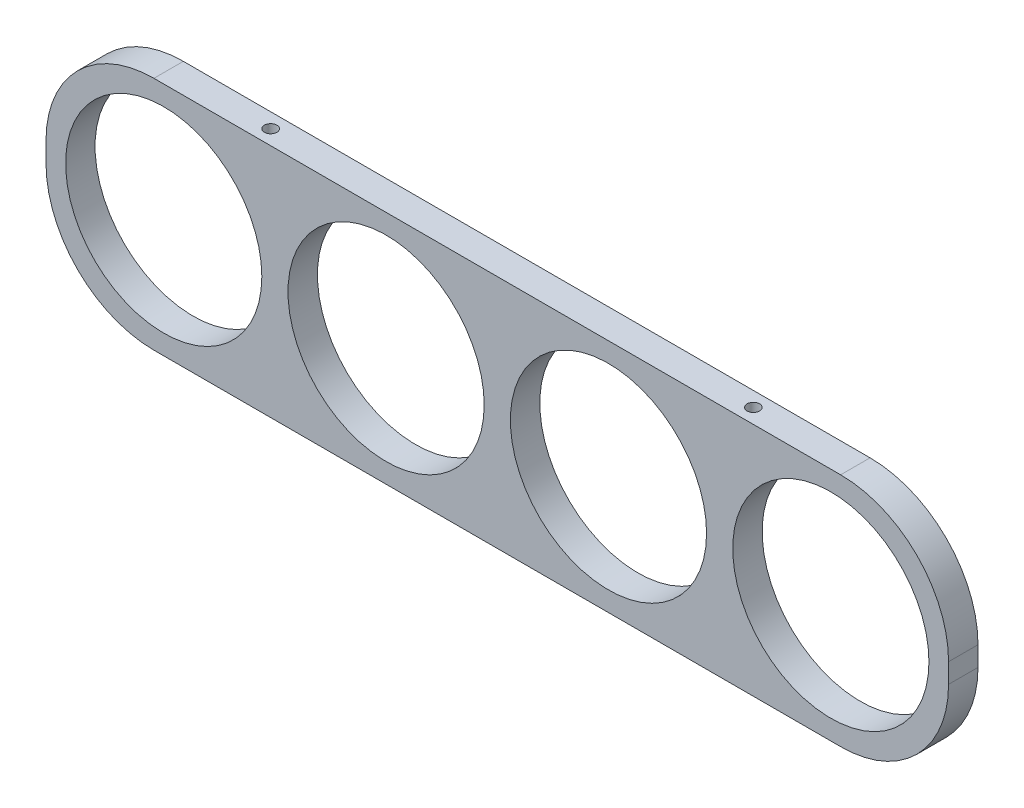
ISO-10303-21;
HEADER;
FILE_DESCRIPTION(('STEP AP214'),'2;1');
FILE_NAME('part.step','',(''),(''),'','','');
FILE_SCHEMA(('AUTOMOTIVE_DESIGN { 1 0 10303 214 1 1 1 1 }'));
ENDSEC;
DATA;
#1=APPLICATION_CONTEXT('core data for automotive mechanical design processes');
#2=APPLICATION_PROTOCOL_DEFINITION('international standard','automotive_design',2000,#1);
#3=PRODUCT_CONTEXT('',#1,'mechanical');
#4=PRODUCT('Part','Part','',(#3));
#5=PRODUCT_RELATED_PRODUCT_CATEGORY('part','',(#4));
#6=PRODUCT_DEFINITION_FORMATION('','',#4);
#7=PRODUCT_DEFINITION_CONTEXT('part definition',#1,'design');
#8=PRODUCT_DEFINITION('design','',#6,#7);
#9=PRODUCT_DEFINITION_SHAPE('','',#8);
#10=(LENGTH_UNIT() NAMED_UNIT(*) SI_UNIT(.MILLI.,.METRE.));
#11=(NAMED_UNIT(*) PLANE_ANGLE_UNIT() SI_UNIT($,.RADIAN.));
#12=(NAMED_UNIT(*) SI_UNIT($,.STERADIAN.) SOLID_ANGLE_UNIT());
#13=UNCERTAINTY_MEASURE_WITH_UNIT(LENGTH_MEASURE(1.E-05),#10,'distance_accuracy_value','');
#14=(GEOMETRIC_REPRESENTATION_CONTEXT(3) GLOBAL_UNCERTAINTY_ASSIGNED_CONTEXT((#13)) GLOBAL_UNIT_ASSIGNED_CONTEXT((#10,
#11,#12)) REPRESENTATION_CONTEXT('',''));
#15=CARTESIAN_POINT('',(0.,0.,0.));
#16=DIRECTION('',(0.,0.,1.));
#17=DIRECTION('',(1.,0.,0.));
#18=AXIS2_PLACEMENT_3D('',#15,#16,#17);
#19=CARTESIAN_POINT('',(-146.05,38.1,4.7625));
#20=DIRECTION('',(1.,0.,0.));
#21=DIRECTION('',(0.,0.,-1.));
#22=AXIS2_PLACEMENT_3D('',#19,#20,#21);
#23=PLANE('',#22);
#24=DIRECTION('',(0.,-1.,0.));
#25=VECTOR('',#24,1.);
#26=CARTESIAN_POINT('',(-146.05,38.1,4.7625));
#27=LINE('',#26,#25);
#28=CARTESIAN_POINT('',(-146.05,3.175,4.7625));
#29=VERTEX_POINT('',#28);
#30=CARTESIAN_POINT('',(-146.05,-3.17500000000001,4.7625));
#31=VERTEX_POINT('',#30);
#32=EDGE_CURVE('E153',#29,#31,#27,.T.);
#33=ORIENTED_EDGE('',*,*,#32,.F.);
#34=DIRECTION('',(0.,0.,-1.));
#35=VECTOR('',#34,1.);
#36=CARTESIAN_POINT('',(-146.05,3.17499999999999,4.7625));
#37=LINE('',#36,#35);
#38=CARTESIAN_POINT('',(-146.05,3.175,-4.7625));
#39=VERTEX_POINT('',#38);
#40=EDGE_CURVE('E175',#29,#39,#37,.T.);
#41=ORIENTED_EDGE('',*,*,#40,.T.);
#42=DIRECTION('',(0.,-1.,0.));
#43=VECTOR('',#42,1.);
#44=CARTESIAN_POINT('',(-146.05,38.1,-4.7625));
#45=LINE('',#44,#43);
#46=CARTESIAN_POINT('',(-146.05,-3.17500000000001,-4.7625));
#47=VERTEX_POINT('',#46);
#48=EDGE_CURVE('E132',#39,#47,#45,.T.);
#49=ORIENTED_EDGE('',*,*,#48,.T.);
#50=DIRECTION('',(0.,0.,-1.));
#51=VECTOR('',#50,1.);
#52=CARTESIAN_POINT('',(-146.05,-3.17500000000003,4.7625));
#53=LINE('',#52,#51);
#54=EDGE_CURVE('E164',#47,#31,#53,.F.);
#55=ORIENTED_EDGE('',*,*,#54,.T.);
#56=EDGE_LOOP('',(#33,#41,#49,#55));
#57=FACE_BOUND('',#56,.T.);
#58=ADVANCED_FACE('F37',(#57),#23,.F.);
#59=CARTESIAN_POINT('',(146.05,-38.1,4.7625));
#60=DIRECTION('',(0.,1.,0.));
#61=DIRECTION('',(-1.,0.,0.));
#62=AXIS2_PLACEMENT_3D('',#59,#60,#61);
#63=PLANE('',#62);
#64=DIRECTION('',(1.,0.,0.));
#65=VECTOR('',#64,1.);
#66=CARTESIAN_POINT('',(146.05,-38.1,-4.7625));
#67=LINE('',#66,#65);
#68=CARTESIAN_POINT('',(-111.125,-38.1,-4.7625));
#69=VERTEX_POINT('',#68);
#70=CARTESIAN_POINT('',(111.125,-38.1,-4.7625));
#71=VERTEX_POINT('',#70);
#72=EDGE_CURVE('E167',#69,#71,#67,.T.);
#73=ORIENTED_EDGE('',*,*,#72,.T.);
#74=DIRECTION('',(0.,0.,-1.));
#75=VECTOR('',#74,1.);
#76=CARTESIAN_POINT('',(111.125,-38.1,4.7625));
#77=LINE('',#76,#75);
#78=CARTESIAN_POINT('',(111.125,-38.1,4.7625));
#79=VERTEX_POINT('',#78);
#80=EDGE_CURVE('E11',#71,#79,#77,.F.);
#81=ORIENTED_EDGE('',*,*,#80,.T.);
#82=DIRECTION('',(1.,0.,0.));
#83=VECTOR('',#82,1.);
#84=CARTESIAN_POINT('',(146.05,-38.1,4.7625));
#85=LINE('',#84,#83);
#86=CARTESIAN_POINT('',(-111.125,-38.1,4.7625));
#87=VERTEX_POINT('',#86);
#88=EDGE_CURVE('E156',#87,#79,#85,.T.);
#89=ORIENTED_EDGE('',*,*,#88,.F.);
#90=DIRECTION('',(0.,0.,-1.));
#91=VECTOR('',#90,1.);
#92=CARTESIAN_POINT('',(-111.125,-38.1,4.7625));
#93=LINE('',#92,#91);
#94=EDGE_CURVE('E45',#87,#69,#93,.T.);
#95=ORIENTED_EDGE('',*,*,#94,.T.);
#96=EDGE_LOOP('',(#73,#81,#89,#95));
#97=FACE_BOUND('',#96,.T.);
#98=ADVANCED_FACE('F206',(#97),#63,.F.);
#99=CARTESIAN_POINT('',(146.05,38.1,4.7625));
#100=DIRECTION('',(-1.,0.,0.));
#101=DIRECTION('',(0.,0.,1.));
#102=AXIS2_PLACEMENT_3D('',#99,#100,#101);
#103=PLANE('',#102);
#104=DIRECTION('',(0.,1.,0.));
#105=VECTOR('',#104,1.);
#106=CARTESIAN_POINT('',(146.05,38.1,4.7625));
#107=LINE('',#106,#105);
#108=CARTESIAN_POINT('',(146.05,-3.17499999999999,4.7625));
#109=VERTEX_POINT('',#108);
#110=CARTESIAN_POINT('',(146.05,3.17500000000003,4.7625));
#111=VERTEX_POINT('',#110);
#112=EDGE_CURVE('E159',#109,#111,#107,.T.);
#113=ORIENTED_EDGE('',*,*,#112,.F.);
#114=DIRECTION('',(0.,0.,-1.));
#115=VECTOR('',#114,1.);
#116=CARTESIAN_POINT('',(146.05,-3.175,4.7625));
#117=LINE('',#116,#115);
#118=CARTESIAN_POINT('',(146.05,-3.17499999999999,-4.7625));
#119=VERTEX_POINT('',#118);
#120=EDGE_CURVE('E199',#109,#119,#117,.T.);
#121=ORIENTED_EDGE('',*,*,#120,.T.);
#122=DIRECTION('',(0.,1.,0.));
#123=VECTOR('',#122,1.);
#124=CARTESIAN_POINT('',(146.05,38.1,-4.7625));
#125=LINE('',#124,#123);
#126=CARTESIAN_POINT('',(146.05,3.17500000000003,-4.7625));
#127=VERTEX_POINT('',#126);
#128=EDGE_CURVE('E170',#119,#127,#125,.T.);
#129=ORIENTED_EDGE('',*,*,#128,.T.);
#130=DIRECTION('',(0.,0.,-1.));
#131=VECTOR('',#130,1.);
#132=CARTESIAN_POINT('',(146.05,3.17500000000001,4.7625));
#133=LINE('',#132,#131);
#134=EDGE_CURVE('E52',#127,#111,#133,.F.);
#135=ORIENTED_EDGE('',*,*,#134,.T.);
#136=EDGE_LOOP('',(#113,#121,#129,#135));
#137=FACE_BOUND('',#136,.T.);
#138=ADVANCED_FACE('F217',(#137),#103,.F.);
#139=CARTESIAN_POINT('',(146.05,38.1,4.7625));
#140=DIRECTION('',(0.,-1.,0.));
#141=DIRECTION('',(1.,0.,0.));
#142=AXIS2_PLACEMENT_3D('',#139,#140,#141);
#143=PLANE('',#142);
#144=CARTESIAN_POINT('',(-78.105,38.1,0.));
#145=DIRECTION('',(0.,1.,0.));
#146=DIRECTION('',(0.,0.,1.));
#147=AXIS2_PLACEMENT_3D('',#144,#145,#146);
#148=CIRCLE('',#147,2.01929999999999);
#149=CARTESIAN_POINT('',(-78.105,38.1,2.01929999999999));
#150=VERTEX_POINT('',#149);
#151=EDGE_CURVE('E118',#150,#150,#148,.T.);
#152=ORIENTED_EDGE('',*,*,#151,.F.);
#153=EDGE_LOOP('',(#152));
#154=FACE_BOUND('',#153,.T.);
#155=CARTESIAN_POINT('',(78.105,38.1,0.));
#156=DIRECTION('',(0.,1.,0.));
#157=DIRECTION('',(0.,0.,1.));
#158=AXIS2_PLACEMENT_3D('',#155,#156,#157);
#159=CIRCLE('',#158,2.01929999999999);
#160=CARTESIAN_POINT('',(78.105,38.1,2.01929999999999));
#161=VERTEX_POINT('',#160);
#162=EDGE_CURVE('E117',#161,#161,#159,.T.);
#163=ORIENTED_EDGE('',*,*,#162,.F.);
#164=EDGE_LOOP('',(#163));
#165=FACE_BOUND('',#164,.T.);
#166=DIRECTION('',(-1.,0.,0.));
#167=VECTOR('',#166,1.);
#168=CARTESIAN_POINT('',(146.05,38.1,-4.7625));
#169=LINE('',#168,#167);
#170=CARTESIAN_POINT('',(111.125,38.1,-4.7625));
#171=VERTEX_POINT('',#170);
#172=CARTESIAN_POINT('',(-111.125,38.1,-4.7625));
#173=VERTEX_POINT('',#172);
#174=EDGE_CURVE('E157',#171,#173,#169,.T.);
#175=ORIENTED_EDGE('',*,*,#174,.T.);
#176=DIRECTION('',(0.,0.,-1.));
#177=VECTOR('',#176,1.);
#178=CARTESIAN_POINT('',(-111.125,38.1,4.7625));
#179=LINE('',#178,#177);
#180=CARTESIAN_POINT('',(-111.125,38.1,4.7625));
#181=VERTEX_POINT('',#180);
#182=EDGE_CURVE('E189',#173,#181,#179,.F.);
#183=ORIENTED_EDGE('',*,*,#182,.T.);
#184=DIRECTION('',(-1.,0.,0.));
#185=VECTOR('',#184,1.);
#186=CARTESIAN_POINT('',(146.05,38.1,4.7625));
#187=LINE('',#186,#185);
#188=CARTESIAN_POINT('',(111.125,38.1,4.7625));
#189=VERTEX_POINT('',#188);
#190=EDGE_CURVE('E161',#189,#181,#187,.T.);
#191=ORIENTED_EDGE('',*,*,#190,.F.);
#192=DIRECTION('',(0.,0.,-1.));
#193=VECTOR('',#192,1.);
#194=CARTESIAN_POINT('',(111.125,38.1,4.7625));
#195=LINE('',#194,#193);
#196=EDGE_CURVE('E186',#189,#171,#195,.T.);
#197=ORIENTED_EDGE('',*,*,#196,.T.);
#198=EDGE_LOOP('',(#175,#183,#191,#197));
#199=FACE_BOUND('',#198,.T.);
#200=ADVANCED_FACE('F225',(#154,#165,#199),#143,.F.);
#201=CARTESIAN_POINT('',(0.,0.,4.7625));
#202=DIRECTION('',(0.,0.,-1.));
#203=DIRECTION('',(-1.,0.,0.));
#204=AXIS2_PLACEMENT_3D('',#201,#202,#203);
#205=PLANE('',#204);
#206=CARTESIAN_POINT('',(-107.95,0.,4.7625));
#207=DIRECTION('',(0.,0.,1.));
#208=DIRECTION('',(1.,0.,0.));
#209=AXIS2_PLACEMENT_3D('',#206,#207,#208);
#210=CIRCLE('',#209,31.75);
#211=CARTESIAN_POINT('',(-76.2,0.,4.7625));
#212=VERTEX_POINT('',#211);
#213=EDGE_CURVE('E133',#212,#212,#210,.T.);
#214=ORIENTED_EDGE('',*,*,#213,.F.);
#215=EDGE_LOOP('',(#214));
#216=FACE_BOUND('',#215,.T.);
#217=CARTESIAN_POINT('',(-35.9833333333333,0.,4.7625));
#218=DIRECTION('',(0.,0.,1.));
#219=DIRECTION('',(1.,0.,0.));
#220=AXIS2_PLACEMENT_3D('',#217,#218,#219);
#221=CIRCLE('',#220,31.75);
#222=CARTESIAN_POINT('',(-4.23333333333334,0.,4.7625));
#223=VERTEX_POINT('',#222);
#224=EDGE_CURVE('E139',#223,#223,#221,.T.);
#225=ORIENTED_EDGE('',*,*,#224,.F.);
#226=EDGE_LOOP('',(#225));
#227=FACE_BOUND('',#226,.T.);
#228=CARTESIAN_POINT('',(35.9833333333333,0.,4.7625));
#229=DIRECTION('',(0.,0.,1.));
#230=DIRECTION('',(1.,0.,0.));
#231=AXIS2_PLACEMENT_3D('',#228,#229,#230);
#232=CIRCLE('',#231,31.75);
#233=CARTESIAN_POINT('',(67.7333333333333,0.,4.7625));
#234=VERTEX_POINT('',#233);
#235=EDGE_CURVE('E145',#234,#234,#232,.T.);
#236=ORIENTED_EDGE('',*,*,#235,.F.);
#237=EDGE_LOOP('',(#236));
#238=FACE_BOUND('',#237,.T.);
#239=CARTESIAN_POINT('',(107.95,0.,4.7625));
#240=DIRECTION('',(0.,0.,1.));
#241=DIRECTION('',(1.,0.,0.));
#242=AXIS2_PLACEMENT_3D('',#239,#240,#241);
#243=CIRCLE('',#242,31.75);
#244=CARTESIAN_POINT('',(139.7,0.,4.7625));
#245=VERTEX_POINT('',#244);
#246=EDGE_CURVE('E128',#245,#245,#243,.T.);
#247=ORIENTED_EDGE('',*,*,#246,.F.);
#248=EDGE_LOOP('',(#247));
#249=FACE_BOUND('',#248,.T.);
#250=ORIENTED_EDGE('',*,*,#190,.T.);
#251=CARTESIAN_POINT('',(-111.125,3.17499999999999,4.7625));
#252=DIRECTION('',(0.,0.,-1.));
#253=DIRECTION('',(-1.,0.,0.));
#254=AXIS2_PLACEMENT_3D('',#251,#252,#253);
#255=CIRCLE('',#254,34.925);
#256=EDGE_CURVE('E196',#181,#29,#255,.F.);
#257=ORIENTED_EDGE('',*,*,#256,.T.);
#258=ORIENTED_EDGE('',*,*,#32,.T.);
#259=CARTESIAN_POINT('',(-111.125,-3.17500000000003,4.7625));
#260=DIRECTION('',(0.,0.,-1.));
#261=DIRECTION('',(-1.,0.,0.));
#262=AXIS2_PLACEMENT_3D('',#259,#260,#261);
#263=CIRCLE('',#262,34.925);
#264=EDGE_CURVE('E193',#31,#87,#263,.F.);
#265=ORIENTED_EDGE('',*,*,#264,.T.);
#266=ORIENTED_EDGE('',*,*,#88,.T.);
#267=CARTESIAN_POINT('',(111.125,-3.175,4.7625));
#268=DIRECTION('',(0.,0.,-1.));
#269=DIRECTION('',(-1.,0.,0.));
#270=AXIS2_PLACEMENT_3D('',#267,#268,#269);
#271=CIRCLE('',#270,34.925);
#272=EDGE_CURVE('E59',#79,#109,#271,.F.);
#273=ORIENTED_EDGE('',*,*,#272,.T.);
#274=ORIENTED_EDGE('',*,*,#112,.T.);
#275=CARTESIAN_POINT('',(111.125,3.17500000000001,4.7625));
#276=DIRECTION('',(0.,0.,-1.));
#277=DIRECTION('',(-1.,0.,0.));
#278=AXIS2_PLACEMENT_3D('',#275,#276,#277);
#279=CIRCLE('',#278,34.925);
#280=EDGE_CURVE('E191',#111,#189,#279,.F.);
#281=ORIENTED_EDGE('',*,*,#280,.T.);
#282=EDGE_LOOP('',(#250,#257,#258,#265,#266,#273,#274,#281));
#283=FACE_BOUND('',#282,.T.);
#284=ADVANCED_FACE('F219',(#216,#227,#238,#249,#283),#205,.F.);
#285=CARTESIAN_POINT('',(0.,0.,-4.7625));
#286=DIRECTION('',(0.,0.,-1.));
#287=DIRECTION('',(-1.,0.,0.));
#288=AXIS2_PLACEMENT_3D('',#285,#286,#287);
#289=PLANE('',#288);
#290=CARTESIAN_POINT('',(-107.95,0.,-4.7625));
#291=DIRECTION('',(0.,0.,1.));
#292=DIRECTION('',(1.,0.,0.));
#293=AXIS2_PLACEMENT_3D('',#290,#291,#292);
#294=CIRCLE('',#293,31.75);
#295=CARTESIAN_POINT('',(-76.2,0.,-4.7625));
#296=VERTEX_POINT('',#295);
#297=EDGE_CURVE('E129',#296,#296,#294,.T.);
#298=ORIENTED_EDGE('',*,*,#297,.T.);
#299=EDGE_LOOP('',(#298));
#300=FACE_BOUND('',#299,.T.);
#301=CARTESIAN_POINT('',(-35.9833333333333,0.,-4.7625));
#302=DIRECTION('',(0.,0.,1.));
#303=DIRECTION('',(1.,0.,0.));
#304=AXIS2_PLACEMENT_3D('',#301,#302,#303);
#305=CIRCLE('',#304,31.75);
#306=CARTESIAN_POINT('',(-4.23333333333334,0.,-4.7625));
#307=VERTEX_POINT('',#306);
#308=EDGE_CURVE('E136',#307,#307,#305,.T.);
#309=ORIENTED_EDGE('',*,*,#308,.T.);
#310=EDGE_LOOP('',(#309));
#311=FACE_BOUND('',#310,.T.);
#312=CARTESIAN_POINT('',(35.9833333333333,0.,-4.7625));
#313=DIRECTION('',(0.,0.,1.));
#314=DIRECTION('',(1.,0.,0.));
#315=AXIS2_PLACEMENT_3D('',#312,#313,#314);
#316=CIRCLE('',#315,31.75);
#317=CARTESIAN_POINT('',(67.7333333333333,0.,-4.7625));
#318=VERTEX_POINT('',#317);
#319=EDGE_CURVE('E142',#318,#318,#316,.T.);
#320=ORIENTED_EDGE('',*,*,#319,.T.);
#321=EDGE_LOOP('',(#320));
#322=FACE_BOUND('',#321,.T.);
#323=CARTESIAN_POINT('',(107.95,0.,-4.7625));
#324=DIRECTION('',(0.,0.,1.));
#325=DIRECTION('',(1.,0.,0.));
#326=AXIS2_PLACEMENT_3D('',#323,#324,#325);
#327=CIRCLE('',#326,31.75);
#328=CARTESIAN_POINT('',(139.7,0.,-4.7625));
#329=VERTEX_POINT('',#328);
#330=EDGE_CURVE('E148',#329,#329,#327,.T.);
#331=ORIENTED_EDGE('',*,*,#330,.T.);
#332=EDGE_LOOP('',(#331));
#333=FACE_BOUND('',#332,.T.);
#334=ORIENTED_EDGE('',*,*,#48,.F.);
#335=CARTESIAN_POINT('',(-111.125,3.17499999999999,-4.7625));
#336=DIRECTION('',(0.,0.,-1.));
#337=DIRECTION('',(-1.,0.,0.));
#338=AXIS2_PLACEMENT_3D('',#335,#336,#337);
#339=CIRCLE('',#338,34.925);
#340=EDGE_CURVE('E184',#39,#173,#339,.T.);
#341=ORIENTED_EDGE('',*,*,#340,.T.);
#342=ORIENTED_EDGE('',*,*,#174,.F.);
#343=CARTESIAN_POINT('',(111.125,3.17500000000001,-4.7625));
#344=DIRECTION('',(0.,0.,-1.));
#345=DIRECTION('',(-1.,0.,0.));
#346=AXIS2_PLACEMENT_3D('',#343,#344,#345);
#347=CIRCLE('',#346,34.925);
#348=EDGE_CURVE('E178',#171,#127,#347,.T.);
#349=ORIENTED_EDGE('',*,*,#348,.T.);
#350=ORIENTED_EDGE('',*,*,#128,.F.);
#351=CARTESIAN_POINT('',(111.125,-3.175,-4.7625));
#352=DIRECTION('',(0.,0.,-1.));
#353=DIRECTION('',(-1.,0.,0.));
#354=AXIS2_PLACEMENT_3D('',#351,#352,#353);
#355=CIRCLE('',#354,34.925);
#356=EDGE_CURVE('E182',#119,#71,#355,.T.);
#357=ORIENTED_EDGE('',*,*,#356,.T.);
#358=ORIENTED_EDGE('',*,*,#72,.F.);
#359=CARTESIAN_POINT('',(-111.125,-3.17500000000003,-4.7625));
#360=DIRECTION('',(0.,0.,-1.));
#361=DIRECTION('',(-1.,0.,0.));
#362=AXIS2_PLACEMENT_3D('',#359,#360,#361);
#363=CIRCLE('',#362,34.925);
#364=EDGE_CURVE('E180',#69,#47,#363,.T.);
#365=ORIENTED_EDGE('',*,*,#364,.T.);
#366=EDGE_LOOP('',(#334,#341,#342,#349,#350,#357,#358,#365));
#367=FACE_BOUND('',#366,.T.);
#368=ADVANCED_FACE('F212',(#300,#311,#322,#333,#367),#289,.T.);
#369=CARTESIAN_POINT('',(107.95,0.,-4.7625));
#370=DIRECTION('',(0.,0.,1.));
#371=DIRECTION('',(1.,0.,0.));
#372=AXIS2_PLACEMENT_3D('',#369,#370,#371);
#373=CYLINDRICAL_SURFACE('',#372,31.75);
#374=CARTESIAN_POINT('',(139.7,0.,-4.7625));
#375=CARTESIAN_POINT('',(139.7,0.,-4.66328125));
#376=CARTESIAN_POINT('',(139.7,0.,-4.5640625));
#377=CARTESIAN_POINT('',(139.7,0.,-4.365625));
#378=CARTESIAN_POINT('',(139.7,0.,-4.26640625));
#379=CARTESIAN_POINT('',(139.7,0.,-4.06796875));
#380=CARTESIAN_POINT('',(139.7,0.,-3.96875));
#381=CARTESIAN_POINT('',(139.7,0.,-3.7703125));
#382=CARTESIAN_POINT('',(139.7,0.,-3.67109375));
#383=CARTESIAN_POINT('',(139.7,0.,-3.47265625));
#384=CARTESIAN_POINT('',(139.7,0.,-3.3734375));
#385=CARTESIAN_POINT('',(139.7,0.,-3.175));
#386=CARTESIAN_POINT('',(139.7,0.,-3.07578125));
#387=CARTESIAN_POINT('',(139.7,0.,-2.87734375));
#388=CARTESIAN_POINT('',(139.7,0.,-2.778125));
#389=CARTESIAN_POINT('',(139.7,0.,-2.5796875));
#390=CARTESIAN_POINT('',(139.7,0.,-2.48046875));
#391=CARTESIAN_POINT('',(139.7,0.,-2.28203125));
#392=CARTESIAN_POINT('',(139.7,0.,-2.1828125));
#393=CARTESIAN_POINT('',(139.7,0.,-1.984375));
#394=CARTESIAN_POINT('',(139.7,0.,-1.88515625));
#395=CARTESIAN_POINT('',(139.7,0.,-1.68671875));
#396=CARTESIAN_POINT('',(139.7,0.,-1.5875));
#397=CARTESIAN_POINT('',(139.7,0.,-1.3890625));
#398=CARTESIAN_POINT('',(139.7,0.,-1.28984375));
#399=CARTESIAN_POINT('',(139.7,0.,-1.09140625));
#400=CARTESIAN_POINT('',(139.7,0.,-0.9921875));
#401=CARTESIAN_POINT('',(139.7,0.,-0.793750000000001));
#402=CARTESIAN_POINT('',(139.7,0.,-0.694531250000001));
#403=CARTESIAN_POINT('',(139.7,0.,-0.496093750000001));
#404=CARTESIAN_POINT('',(139.7,0.,-0.396875000000001));
#405=CARTESIAN_POINT('',(139.7,0.,-0.198437500000001));
#406=CARTESIAN_POINT('',(139.7,0.,-0.0992187500000009));
#407=CARTESIAN_POINT('',(139.7,0.,0.0992187499999992));
#408=CARTESIAN_POINT('',(139.7,0.,0.198437499999999));
#409=CARTESIAN_POINT('',(139.7,0.,0.396874999999999));
#410=CARTESIAN_POINT('',(139.7,0.,0.496093749999999));
#411=CARTESIAN_POINT('',(139.7,0.,0.694531249999999));
#412=CARTESIAN_POINT('',(139.7,0.,0.79375));
#413=CARTESIAN_POINT('',(139.7,0.,0.9921875));
#414=CARTESIAN_POINT('',(139.7,0.,1.09140625));
#415=CARTESIAN_POINT('',(139.7,0.,1.28984375));
#416=CARTESIAN_POINT('',(139.7,0.,1.3890625));
#417=CARTESIAN_POINT('',(139.7,0.,1.5875));
#418=CARTESIAN_POINT('',(139.7,0.,1.68671875));
#419=CARTESIAN_POINT('',(139.7,0.,1.88515625));
#420=CARTESIAN_POINT('',(139.7,0.,1.984375));
#421=CARTESIAN_POINT('',(139.7,0.,2.1828125));
#422=CARTESIAN_POINT('',(139.7,0.,2.28203125));
#423=CARTESIAN_POINT('',(139.7,0.,2.48046875));
#424=CARTESIAN_POINT('',(139.7,0.,2.5796875));
#425=CARTESIAN_POINT('',(139.7,0.,2.778125));
#426=CARTESIAN_POINT('',(139.7,0.,2.87734375));
#427=CARTESIAN_POINT('',(139.7,0.,3.07578125));
#428=CARTESIAN_POINT('',(139.7,0.,3.175));
#429=CARTESIAN_POINT('',(139.7,0.,3.3734375));
#430=CARTESIAN_POINT('',(139.7,0.,3.47265625));
#431=CARTESIAN_POINT('',(139.7,0.,3.67109375));
#432=CARTESIAN_POINT('',(139.7,0.,3.7703125));
#433=CARTESIAN_POINT('',(139.7,0.,3.96875));
#434=CARTESIAN_POINT('',(139.7,0.,4.06796875));
#435=CARTESIAN_POINT('',(139.7,0.,4.26640625));
#436=CARTESIAN_POINT('',(139.7,0.,4.365625));
#437=CARTESIAN_POINT('',(139.7,0.,4.5640625));
#438=CARTESIAN_POINT('',(139.7,0.,4.66328125));
#439=CARTESIAN_POINT('',(139.7,0.,4.7625));
#440=B_SPLINE_CURVE_WITH_KNOTS('',3,(#374,#375,#376,#377,#378,#379,#380,#381,#382,#383,#384,
#385,#386,#387,#388,#389,#390,#391,#392,#393,#394,#395,#396,#397,#398,#399,#400,#401,#402,#403,
#404,#405,#406,#407,#408,#409,#410,#411,#412,#413,#414,#415,#416,#417,#418,#419,#420,#421,#422,
#423,#424,#425,#426,#427,#428,#429,#430,#431,#432,#433,#434,#435,#436,#437,#438,#439),
.UNSPECIFIED.,.F.,.F.,(4,2,2,2,2,2,2,2,2,2,2,2,2,2,2,2,2,2,2,2,2,2,2,2,2,2,2,2,2,2,2,2,4),(0.,
0.29765625,0.5953125,0.892968750000001,1.190625,1.48828125,1.7859375,2.08359375,2.38125,
2.67890625,2.9765625,3.27421875,3.571875,3.86953125,4.1671875,4.46484375,4.7625,5.06015625,
5.3578125,5.65546875,5.953125,6.25078125,6.5484375,6.84609375,7.14375,7.44140625,7.7390625,
8.03671875,8.334375,8.63203125,8.9296875,9.22734375,9.525),.UNSPECIFIED.);
#441=EDGE_CURVE('BSEAM271',#329,#245,#440,.T.);
#442=ORIENTED_EDGE('',*,*,#330,.F.);
#443=ORIENTED_EDGE('',*,*,#246,.T.);
#444=ORIENTED_EDGE('',*,*,#441,.T.);
#445=ORIENTED_EDGE('',*,*,#441,.F.);
#446=EDGE_LOOP('',(#442,#444,#443,#445));
#447=FACE_BOUND('',#446,.T.);
#448=ADVANCED_FACE('F271',(#447),#373,.F.);
#449=CARTESIAN_POINT('',(35.9833333333333,0.,-4.7625));
#450=DIRECTION('',(0.,0.,1.));
#451=DIRECTION('',(1.,0.,0.));
#452=AXIS2_PLACEMENT_3D('',#449,#450,#451);
#453=CYLINDRICAL_SURFACE('',#452,31.75);
#454=CARTESIAN_POINT('',(67.7333333333333,0.,-4.7625));
#455=CARTESIAN_POINT('',(67.7333333333333,0.,-4.66328125));
#456=CARTESIAN_POINT('',(67.7333333333333,0.,-4.5640625));
#457=CARTESIAN_POINT('',(67.7333333333333,0.,-4.365625));
#458=CARTESIAN_POINT('',(67.7333333333333,0.,-4.26640625));
#459=CARTESIAN_POINT('',(67.7333333333333,0.,-4.06796875));
#460=CARTESIAN_POINT('',(67.7333333333333,0.,-3.96875));
#461=CARTESIAN_POINT('',(67.7333333333333,0.,-3.7703125));
#462=CARTESIAN_POINT('',(67.7333333333333,0.,-3.67109375));
#463=CARTESIAN_POINT('',(67.7333333333333,0.,-3.47265625));
#464=CARTESIAN_POINT('',(67.7333333333333,0.,-3.3734375));
#465=CARTESIAN_POINT('',(67.7333333333333,0.,-3.175));
#466=CARTESIAN_POINT('',(67.7333333333333,0.,-3.07578125));
#467=CARTESIAN_POINT('',(67.7333333333333,0.,-2.87734375));
#468=CARTESIAN_POINT('',(67.7333333333333,0.,-2.778125));
#469=CARTESIAN_POINT('',(67.7333333333333,0.,-2.5796875));
#470=CARTESIAN_POINT('',(67.7333333333333,0.,-2.48046875));
#471=CARTESIAN_POINT('',(67.7333333333333,0.,-2.28203125));
#472=CARTESIAN_POINT('',(67.7333333333333,0.,-2.1828125));
#473=CARTESIAN_POINT('',(67.7333333333333,0.,-1.984375));
#474=CARTESIAN_POINT('',(67.7333333333333,0.,-1.88515625));
#475=CARTESIAN_POINT('',(67.7333333333333,0.,-1.68671875));
#476=CARTESIAN_POINT('',(67.7333333333333,0.,-1.5875));
#477=CARTESIAN_POINT('',(67.7333333333333,0.,-1.3890625));
#478=CARTESIAN_POINT('',(67.7333333333333,0.,-1.28984375));
#479=CARTESIAN_POINT('',(67.7333333333333,0.,-1.09140625));
#480=CARTESIAN_POINT('',(67.7333333333333,0.,-0.9921875));
#481=CARTESIAN_POINT('',(67.7333333333333,0.,-0.793750000000001));
#482=CARTESIAN_POINT('',(67.7333333333333,0.,-0.694531250000001));
#483=CARTESIAN_POINT('',(67.7333333333333,0.,-0.496093750000001));
#484=CARTESIAN_POINT('',(67.7333333333333,0.,-0.396875000000001));
#485=CARTESIAN_POINT('',(67.7333333333333,0.,-0.198437500000001));
#486=CARTESIAN_POINT('',(67.7333333333333,0.,-0.0992187500000009));
#487=CARTESIAN_POINT('',(67.7333333333333,0.,0.0992187499999992));
#488=CARTESIAN_POINT('',(67.7333333333333,0.,0.198437499999999));
#489=CARTESIAN_POINT('',(67.7333333333333,0.,0.396874999999999));
#490=CARTESIAN_POINT('',(67.7333333333333,0.,0.496093749999999));
#491=CARTESIAN_POINT('',(67.7333333333333,0.,0.694531249999999));
#492=CARTESIAN_POINT('',(67.7333333333333,0.,0.79375));
#493=CARTESIAN_POINT('',(67.7333333333333,0.,0.9921875));
#494=CARTESIAN_POINT('',(67.7333333333333,0.,1.09140625));
#495=CARTESIAN_POINT('',(67.7333333333333,0.,1.28984375));
#496=CARTESIAN_POINT('',(67.7333333333333,0.,1.3890625));
#497=CARTESIAN_POINT('',(67.7333333333333,0.,1.5875));
#498=CARTESIAN_POINT('',(67.7333333333333,0.,1.68671875));
#499=CARTESIAN_POINT('',(67.7333333333333,0.,1.88515625));
#500=CARTESIAN_POINT('',(67.7333333333333,0.,1.984375));
#501=CARTESIAN_POINT('',(67.7333333333333,0.,2.1828125));
#502=CARTESIAN_POINT('',(67.7333333333333,0.,2.28203125));
#503=CARTESIAN_POINT('',(67.7333333333333,0.,2.48046875));
#504=CARTESIAN_POINT('',(67.7333333333333,0.,2.5796875));
#505=CARTESIAN_POINT('',(67.7333333333333,0.,2.778125));
#506=CARTESIAN_POINT('',(67.7333333333333,0.,2.87734375));
#507=CARTESIAN_POINT('',(67.7333333333333,0.,3.07578125));
#508=CARTESIAN_POINT('',(67.7333333333333,0.,3.175));
#509=CARTESIAN_POINT('',(67.7333333333333,0.,3.3734375));
#510=CARTESIAN_POINT('',(67.7333333333333,0.,3.47265625));
#511=CARTESIAN_POINT('',(67.7333333333333,0.,3.67109375));
#512=CARTESIAN_POINT('',(67.7333333333333,0.,3.7703125));
#513=CARTESIAN_POINT('',(67.7333333333333,0.,3.96875));
#514=CARTESIAN_POINT('',(67.7333333333333,0.,4.06796875));
#515=CARTESIAN_POINT('',(67.7333333333333,0.,4.26640625));
#516=CARTESIAN_POINT('',(67.7333333333333,0.,4.365625));
#517=CARTESIAN_POINT('',(67.7333333333333,0.,4.5640625));
#518=CARTESIAN_POINT('',(67.7333333333333,0.,4.66328125));
#519=CARTESIAN_POINT('',(67.7333333333333,0.,4.7625));
#520=B_SPLINE_CURVE_WITH_KNOTS('',3,(#454,#455,#456,#457,#458,#459,#460,#461,#462,#463,#464,
#465,#466,#467,#468,#469,#470,#471,#472,#473,#474,#475,#476,#477,#478,#479,#480,#481,#482,#483,
#484,#485,#486,#487,#488,#489,#490,#491,#492,#493,#494,#495,#496,#497,#498,#499,#500,#501,#502,
#503,#504,#505,#506,#507,#508,#509,#510,#511,#512,#513,#514,#515,#516,#517,#518,#519),
.UNSPECIFIED.,.F.,.F.,(4,2,2,2,2,2,2,2,2,2,2,2,2,2,2,2,2,2,2,2,2,2,2,2,2,2,2,2,2,2,2,2,4),(0.,
0.29765625,0.5953125,0.892968750000001,1.190625,1.48828125,1.7859375,2.08359375,2.38125,
2.67890625,2.9765625,3.27421875,3.571875,3.86953125,4.1671875,4.46484375,4.7625,5.06015625,
5.3578125,5.65546875,5.953125,6.25078125,6.5484375,6.84609375,7.14375,7.44140625,7.7390625,
8.03671875,8.334375,8.63203125,8.9296875,9.22734375,9.525),.UNSPECIFIED.);
#521=EDGE_CURVE('BSEAM261',#318,#234,#520,.T.);
#522=ORIENTED_EDGE('',*,*,#319,.F.);
#523=ORIENTED_EDGE('',*,*,#235,.T.);
#524=ORIENTED_EDGE('',*,*,#521,.T.);
#525=ORIENTED_EDGE('',*,*,#521,.F.);
#526=EDGE_LOOP('',(#522,#524,#523,#525));
#527=FACE_BOUND('',#526,.T.);
#528=ADVANCED_FACE('F261',(#527),#453,.F.);
#529=CARTESIAN_POINT('',(-35.9833333333333,0.,-4.7625));
#530=DIRECTION('',(0.,0.,1.));
#531=DIRECTION('',(1.,0.,0.));
#532=AXIS2_PLACEMENT_3D('',#529,#530,#531);
#533=CYLINDRICAL_SURFACE('',#532,31.75);
#534=CARTESIAN_POINT('',(-4.23333333333334,0.,-4.7625));
#535=CARTESIAN_POINT('',(-4.23333333333334,0.,-4.66328125));
#536=CARTESIAN_POINT('',(-4.23333333333334,0.,-4.5640625));
#537=CARTESIAN_POINT('',(-4.23333333333334,0.,-4.365625));
#538=CARTESIAN_POINT('',(-4.23333333333334,0.,-4.26640625));
#539=CARTESIAN_POINT('',(-4.23333333333334,0.,-4.06796875));
#540=CARTESIAN_POINT('',(-4.23333333333334,0.,-3.96875));
#541=CARTESIAN_POINT('',(-4.23333333333334,0.,-3.7703125));
#542=CARTESIAN_POINT('',(-4.23333333333334,0.,-3.67109375));
#543=CARTESIAN_POINT('',(-4.23333333333334,0.,-3.47265625));
#544=CARTESIAN_POINT('',(-4.23333333333334,0.,-3.3734375));
#545=CARTESIAN_POINT('',(-4.23333333333334,0.,-3.175));
#546=CARTESIAN_POINT('',(-4.23333333333334,0.,-3.07578125));
#547=CARTESIAN_POINT('',(-4.23333333333334,0.,-2.87734375));
#548=CARTESIAN_POINT('',(-4.23333333333334,0.,-2.778125));
#549=CARTESIAN_POINT('',(-4.23333333333334,0.,-2.5796875));
#550=CARTESIAN_POINT('',(-4.23333333333334,0.,-2.48046875));
#551=CARTESIAN_POINT('',(-4.23333333333334,0.,-2.28203125));
#552=CARTESIAN_POINT('',(-4.23333333333334,0.,-2.1828125));
#553=CARTESIAN_POINT('',(-4.23333333333334,0.,-1.984375));
#554=CARTESIAN_POINT('',(-4.23333333333334,0.,-1.88515625));
#555=CARTESIAN_POINT('',(-4.23333333333334,0.,-1.68671875));
#556=CARTESIAN_POINT('',(-4.23333333333334,0.,-1.5875));
#557=CARTESIAN_POINT('',(-4.23333333333334,0.,-1.3890625));
#558=CARTESIAN_POINT('',(-4.23333333333334,0.,-1.28984375));
#559=CARTESIAN_POINT('',(-4.23333333333334,0.,-1.09140625));
#560=CARTESIAN_POINT('',(-4.23333333333334,0.,-0.9921875));
#561=CARTESIAN_POINT('',(-4.23333333333334,0.,-0.793750000000001));
#562=CARTESIAN_POINT('',(-4.23333333333334,0.,-0.694531250000001));
#563=CARTESIAN_POINT('',(-4.23333333333334,0.,-0.496093750000001));
#564=CARTESIAN_POINT('',(-4.23333333333334,0.,-0.396875000000001));
#565=CARTESIAN_POINT('',(-4.23333333333334,0.,-0.198437500000001));
#566=CARTESIAN_POINT('',(-4.23333333333334,0.,-0.0992187500000009));
#567=CARTESIAN_POINT('',(-4.23333333333334,0.,0.0992187499999992));
#568=CARTESIAN_POINT('',(-4.23333333333334,0.,0.198437499999999));
#569=CARTESIAN_POINT('',(-4.23333333333334,0.,0.396874999999999));
#570=CARTESIAN_POINT('',(-4.23333333333334,0.,0.496093749999999));
#571=CARTESIAN_POINT('',(-4.23333333333334,0.,0.694531249999999));
#572=CARTESIAN_POINT('',(-4.23333333333334,0.,0.79375));
#573=CARTESIAN_POINT('',(-4.23333333333334,0.,0.9921875));
#574=CARTESIAN_POINT('',(-4.23333333333334,0.,1.09140625));
#575=CARTESIAN_POINT('',(-4.23333333333334,0.,1.28984375));
#576=CARTESIAN_POINT('',(-4.23333333333334,0.,1.3890625));
#577=CARTESIAN_POINT('',(-4.23333333333334,0.,1.5875));
#578=CARTESIAN_POINT('',(-4.23333333333334,0.,1.68671875));
#579=CARTESIAN_POINT('',(-4.23333333333334,0.,1.88515625));
#580=CARTESIAN_POINT('',(-4.23333333333334,0.,1.984375));
#581=CARTESIAN_POINT('',(-4.23333333333334,0.,2.1828125));
#582=CARTESIAN_POINT('',(-4.23333333333334,0.,2.28203125));
#583=CARTESIAN_POINT('',(-4.23333333333334,0.,2.48046875));
#584=CARTESIAN_POINT('',(-4.23333333333334,0.,2.5796875));
#585=CARTESIAN_POINT('',(-4.23333333333334,0.,2.778125));
#586=CARTESIAN_POINT('',(-4.23333333333334,0.,2.87734375));
#587=CARTESIAN_POINT('',(-4.23333333333334,0.,3.07578125));
#588=CARTESIAN_POINT('',(-4.23333333333334,0.,3.175));
#589=CARTESIAN_POINT('',(-4.23333333333334,0.,3.3734375));
#590=CARTESIAN_POINT('',(-4.23333333333334,0.,3.47265625));
#591=CARTESIAN_POINT('',(-4.23333333333334,0.,3.67109375));
#592=CARTESIAN_POINT('',(-4.23333333333334,0.,3.7703125));
#593=CARTESIAN_POINT('',(-4.23333333333334,0.,3.96875));
#594=CARTESIAN_POINT('',(-4.23333333333334,0.,4.06796875));
#595=CARTESIAN_POINT('',(-4.23333333333334,0.,4.26640625));
#596=CARTESIAN_POINT('',(-4.23333333333334,0.,4.365625));
#597=CARTESIAN_POINT('',(-4.23333333333334,0.,4.5640625));
#598=CARTESIAN_POINT('',(-4.23333333333334,0.,4.66328125));
#599=CARTESIAN_POINT('',(-4.23333333333334,0.,4.7625));
#600=B_SPLINE_CURVE_WITH_KNOTS('',3,(#534,#535,#536,#537,#538,#539,#540,#541,#542,#543,#544,
#545,#546,#547,#548,#549,#550,#551,#552,#553,#554,#555,#556,#557,#558,#559,#560,#561,#562,#563,
#564,#565,#566,#567,#568,#569,#570,#571,#572,#573,#574,#575,#576,#577,#578,#579,#580,#581,#582,
#583,#584,#585,#586,#587,#588,#589,#590,#591,#592,#593,#594,#595,#596,#597,#598,#599),
.UNSPECIFIED.,.F.,.F.,(4,2,2,2,2,2,2,2,2,2,2,2,2,2,2,2,2,2,2,2,2,2,2,2,2,2,2,2,2,2,2,2,4),(0.,
0.29765625,0.5953125,0.892968750000001,1.190625,1.48828125,1.7859375,2.08359375,2.38125,
2.67890625,2.9765625,3.27421875,3.571875,3.86953125,4.1671875,4.46484375,4.7625,5.06015625,
5.3578125,5.65546875,5.953125,6.25078125,6.5484375,6.84609375,7.14375,7.44140625,7.7390625,
8.03671875,8.334375,8.63203125,8.9296875,9.22734375,9.525),.UNSPECIFIED.);
#601=EDGE_CURVE('BSEAM255',#307,#223,#600,.T.);
#602=ORIENTED_EDGE('',*,*,#308,.F.);
#603=ORIENTED_EDGE('',*,*,#224,.T.);
#604=ORIENTED_EDGE('',*,*,#601,.T.);
#605=ORIENTED_EDGE('',*,*,#601,.F.);
#606=EDGE_LOOP('',(#602,#604,#603,#605));
#607=FACE_BOUND('',#606,.T.);
#608=ADVANCED_FACE('F255',(#607),#533,.F.);
#609=CARTESIAN_POINT('',(-107.95,0.,-4.7625));
#610=DIRECTION('',(0.,0.,1.));
#611=DIRECTION('',(1.,0.,0.));
#612=AXIS2_PLACEMENT_3D('',#609,#610,#611);
#613=CYLINDRICAL_SURFACE('',#612,31.75);
#614=CARTESIAN_POINT('',(-76.2,0.,-4.7625));
#615=CARTESIAN_POINT('',(-76.2,0.,-4.66328125));
#616=CARTESIAN_POINT('',(-76.2,0.,-4.5640625));
#617=CARTESIAN_POINT('',(-76.2,0.,-4.365625));
#618=CARTESIAN_POINT('',(-76.2,0.,-4.26640625));
#619=CARTESIAN_POINT('',(-76.2,0.,-4.06796875));
#620=CARTESIAN_POINT('',(-76.2,0.,-3.96875));
#621=CARTESIAN_POINT('',(-76.2,0.,-3.7703125));
#622=CARTESIAN_POINT('',(-76.2,0.,-3.67109375));
#623=CARTESIAN_POINT('',(-76.2,0.,-3.47265625));
#624=CARTESIAN_POINT('',(-76.2,0.,-3.3734375));
#625=CARTESIAN_POINT('',(-76.2,0.,-3.175));
#626=CARTESIAN_POINT('',(-76.2,0.,-3.07578125));
#627=CARTESIAN_POINT('',(-76.2,0.,-2.87734375));
#628=CARTESIAN_POINT('',(-76.2,0.,-2.778125));
#629=CARTESIAN_POINT('',(-76.2,0.,-2.5796875));
#630=CARTESIAN_POINT('',(-76.2,0.,-2.48046875));
#631=CARTESIAN_POINT('',(-76.2,0.,-2.28203125));
#632=CARTESIAN_POINT('',(-76.2,0.,-2.1828125));
#633=CARTESIAN_POINT('',(-76.2,0.,-1.984375));
#634=CARTESIAN_POINT('',(-76.2,0.,-1.88515625));
#635=CARTESIAN_POINT('',(-76.2,0.,-1.68671875));
#636=CARTESIAN_POINT('',(-76.2,0.,-1.5875));
#637=CARTESIAN_POINT('',(-76.2,0.,-1.3890625));
#638=CARTESIAN_POINT('',(-76.2,0.,-1.28984375));
#639=CARTESIAN_POINT('',(-76.2,0.,-1.09140625));
#640=CARTESIAN_POINT('',(-76.2,0.,-0.9921875));
#641=CARTESIAN_POINT('',(-76.2,0.,-0.793750000000001));
#642=CARTESIAN_POINT('',(-76.2,0.,-0.694531250000001));
#643=CARTESIAN_POINT('',(-76.2,0.,-0.496093750000001));
#644=CARTESIAN_POINT('',(-76.2,0.,-0.396875000000001));
#645=CARTESIAN_POINT('',(-76.2,0.,-0.198437500000001));
#646=CARTESIAN_POINT('',(-76.2,0.,-0.0992187500000009));
#647=CARTESIAN_POINT('',(-76.2,0.,0.0992187499999992));
#648=CARTESIAN_POINT('',(-76.2,0.,0.198437499999999));
#649=CARTESIAN_POINT('',(-76.2,0.,0.396874999999999));
#650=CARTESIAN_POINT('',(-76.2,0.,0.496093749999999));
#651=CARTESIAN_POINT('',(-76.2,0.,0.694531249999999));
#652=CARTESIAN_POINT('',(-76.2,0.,0.79375));
#653=CARTESIAN_POINT('',(-76.2,0.,0.9921875));
#654=CARTESIAN_POINT('',(-76.2,0.,1.09140625));
#655=CARTESIAN_POINT('',(-76.2,0.,1.28984375));
#656=CARTESIAN_POINT('',(-76.2,0.,1.3890625));
#657=CARTESIAN_POINT('',(-76.2,0.,1.5875));
#658=CARTESIAN_POINT('',(-76.2,0.,1.68671875));
#659=CARTESIAN_POINT('',(-76.2,0.,1.88515625));
#660=CARTESIAN_POINT('',(-76.2,0.,1.984375));
#661=CARTESIAN_POINT('',(-76.2,0.,2.1828125));
#662=CARTESIAN_POINT('',(-76.2,0.,2.28203125));
#663=CARTESIAN_POINT('',(-76.2,0.,2.48046875));
#664=CARTESIAN_POINT('',(-76.2,0.,2.5796875));
#665=CARTESIAN_POINT('',(-76.2,0.,2.778125));
#666=CARTESIAN_POINT('',(-76.2,0.,2.87734375));
#667=CARTESIAN_POINT('',(-76.2,0.,3.07578125));
#668=CARTESIAN_POINT('',(-76.2,0.,3.175));
#669=CARTESIAN_POINT('',(-76.2,0.,3.3734375));
#670=CARTESIAN_POINT('',(-76.2,0.,3.47265625));
#671=CARTESIAN_POINT('',(-76.2,0.,3.67109375));
#672=CARTESIAN_POINT('',(-76.2,0.,3.7703125));
#673=CARTESIAN_POINT('',(-76.2,0.,3.96875));
#674=CARTESIAN_POINT('',(-76.2,0.,4.06796875));
#675=CARTESIAN_POINT('',(-76.2,0.,4.26640625));
#676=CARTESIAN_POINT('',(-76.2,0.,4.365625));
#677=CARTESIAN_POINT('',(-76.2,0.,4.5640625));
#678=CARTESIAN_POINT('',(-76.2,0.,4.66328125));
#679=CARTESIAN_POINT('',(-76.2,0.,4.7625));
#680=B_SPLINE_CURVE_WITH_KNOTS('',3,(#614,#615,#616,#617,#618,#619,#620,#621,#622,#623,#624,
#625,#626,#627,#628,#629,#630,#631,#632,#633,#634,#635,#636,#637,#638,#639,#640,#641,#642,#643,
#644,#645,#646,#647,#648,#649,#650,#651,#652,#653,#654,#655,#656,#657,#658,#659,#660,#661,#662,
#663,#664,#665,#666,#667,#668,#669,#670,#671,#672,#673,#674,#675,#676,#677,#678,#679),
.UNSPECIFIED.,.F.,.F.,(4,2,2,2,2,2,2,2,2,2,2,2,2,2,2,2,2,2,2,2,2,2,2,2,2,2,2,2,2,2,2,2,4),(0.,
0.29765625,0.5953125,0.892968750000001,1.190625,1.48828125,1.7859375,2.08359375,2.38125,
2.67890625,2.9765625,3.27421875,3.571875,3.86953125,4.1671875,4.46484375,4.7625,5.06015625,
5.3578125,5.65546875,5.953125,6.25078125,6.5484375,6.84609375,7.14375,7.44140625,7.7390625,
8.03671875,8.334375,8.63203125,8.9296875,9.22734375,9.525),.UNSPECIFIED.);
#681=EDGE_CURVE('BSEAM251',#296,#212,#680,.T.);
#682=ORIENTED_EDGE('',*,*,#297,.F.);
#683=ORIENTED_EDGE('',*,*,#213,.T.);
#684=ORIENTED_EDGE('',*,*,#681,.T.);
#685=ORIENTED_EDGE('',*,*,#681,.F.);
#686=EDGE_LOOP('',(#682,#684,#683,#685));
#687=FACE_BOUND('',#686,.T.);
#688=ADVANCED_FACE('F251',(#687),#613,.F.);
#689=CARTESIAN_POINT('',(-111.125,3.17499999999999,4.7625));
#690=DIRECTION('',(0.,0.,-1.));
#691=DIRECTION('',(-1.,0.,0.));
#692=AXIS2_PLACEMENT_3D('',#689,#690,#691);
#693=CYLINDRICAL_SURFACE('',#692,34.925);
#694=ORIENTED_EDGE('',*,*,#256,.F.);
#695=ORIENTED_EDGE('',*,*,#182,.F.);
#696=ORIENTED_EDGE('',*,*,#340,.F.);
#697=ORIENTED_EDGE('',*,*,#40,.F.);
#698=EDGE_LOOP('',(#694,#695,#696,#697));
#699=FACE_BOUND('',#698,.T.);
#700=ADVANCED_FACE('F230',(#699),#693,.T.);
#701=CARTESIAN_POINT('',(111.125,-3.175,4.7625));
#702=DIRECTION('',(0.,0.,-1.));
#703=DIRECTION('',(-1.,0.,0.));
#704=AXIS2_PLACEMENT_3D('',#701,#702,#703);
#705=CYLINDRICAL_SURFACE('',#704,34.925);
#706=ORIENTED_EDGE('',*,*,#272,.F.);
#707=ORIENTED_EDGE('',*,*,#80,.F.);
#708=ORIENTED_EDGE('',*,*,#356,.F.);
#709=ORIENTED_EDGE('',*,*,#120,.F.);
#710=EDGE_LOOP('',(#706,#707,#708,#709));
#711=FACE_BOUND('',#710,.T.);
#712=ADVANCED_FACE('F216',(#711),#705,.T.);
#713=CARTESIAN_POINT('',(-111.125,-3.17500000000003,4.7625));
#714=DIRECTION('',(0.,0.,-1.));
#715=DIRECTION('',(-1.,0.,0.));
#716=AXIS2_PLACEMENT_3D('',#713,#714,#715);
#717=CYLINDRICAL_SURFACE('',#716,34.925);
#718=ORIENTED_EDGE('',*,*,#264,.F.);
#719=ORIENTED_EDGE('',*,*,#54,.F.);
#720=ORIENTED_EDGE('',*,*,#364,.F.);
#721=ORIENTED_EDGE('',*,*,#94,.F.);
#722=EDGE_LOOP('',(#718,#719,#720,#721));
#723=FACE_BOUND('',#722,.T.);
#724=ADVANCED_FACE('F234',(#723),#717,.T.);
#725=CARTESIAN_POINT('',(111.125,3.17500000000001,4.7625));
#726=DIRECTION('',(0.,0.,-1.));
#727=DIRECTION('',(-1.,0.,0.));
#728=AXIS2_PLACEMENT_3D('',#725,#726,#727);
#729=CYLINDRICAL_SURFACE('',#728,34.925);
#730=ORIENTED_EDGE('',*,*,#280,.F.);
#731=ORIENTED_EDGE('',*,*,#134,.F.);
#732=ORIENTED_EDGE('',*,*,#348,.F.);
#733=ORIENTED_EDGE('',*,*,#196,.F.);
#734=EDGE_LOOP('',(#730,#731,#732,#733));
#735=FACE_BOUND('',#734,.T.);
#736=ADVANCED_FACE('F39',(#735),#729,.T.);
#737=CARTESIAN_POINT('',(78.105,19.05,0.));
#738=DIRECTION('',(0.,1.,0.));
#739=DIRECTION('',(0.,0.,1.));
#740=AXIS2_PLACEMENT_3D('',#737,#738,#739);
#741=CONICAL_SURFACE('',#740,2.01929999999999,1.02974425867665);
#742=CARTESIAN_POINT('',(78.105,17.8366821519976,0.));
#743=VERTEX_POINT('',#742);
#744=VERTEX_LOOP('',#743);
#745=FACE_BOUND('',#744,.T.);
#746=CARTESIAN_POINT('',(78.105,19.05,0.));
#747=DIRECTION('',(0.,1.,0.));
#748=DIRECTION('',(0.,0.,1.));
#749=AXIS2_PLACEMENT_3D('',#746,#747,#748);
#750=CIRCLE('',#749,2.01929999999999);
#751=CARTESIAN_POINT('',(78.105,19.05,2.01929999999999));
#752=VERTEX_POINT('',#751);
#753=EDGE_CURVE('E121',#752,#752,#750,.T.);
#754=ORIENTED_EDGE('',*,*,#753,.T.);
#755=EDGE_LOOP('',(#754));
#756=FACE_BOUND('',#755,.T.);
#757=ADVANCED_FACE('F240',(#745,#756),#741,.F.);
#758=CARTESIAN_POINT('',(78.105,38.1,0.));
#759=DIRECTION('',(0.,1.,0.));
#760=DIRECTION('',(0.,0.,1.));
#761=AXIS2_PLACEMENT_3D('',#758,#759,#760);
#762=CYLINDRICAL_SURFACE('',#761,2.01929999999999);
#763=ORIENTED_EDGE('',*,*,#753,.F.);
#764=EDGE_LOOP('',(#763));
#765=FACE_BOUND('',#764,.T.);
#766=ORIENTED_EDGE('',*,*,#162,.T.);
#767=EDGE_LOOP('',(#766));
#768=FACE_BOUND('',#767,.T.);
#769=ADVANCED_FACE('F111',(#765,#768),#762,.F.);
#770=CARTESIAN_POINT('',(-78.105,19.05,0.));
#771=DIRECTION('',(0.,1.,0.));
#772=DIRECTION('',(0.,0.,1.));
#773=AXIS2_PLACEMENT_3D('',#770,#771,#772);
#774=CONICAL_SURFACE('',#773,2.01929999999999,1.02974425867665);
#775=CARTESIAN_POINT('',(-78.105,17.8366821519976,0.));
#776=VERTEX_POINT('',#775);
#777=VERTEX_LOOP('',#776);
#778=FACE_BOUND('',#777,.T.);
#779=CARTESIAN_POINT('',(-78.105,19.05,0.));
#780=DIRECTION('',(0.,1.,0.));
#781=DIRECTION('',(0.,0.,1.));
#782=AXIS2_PLACEMENT_3D('',#779,#780,#781);
#783=CIRCLE('',#782,2.01929999999999);
#784=CARTESIAN_POINT('',(-78.105,19.05,2.01929999999999));
#785=VERTEX_POINT('',#784);
#786=EDGE_CURVE('E115',#785,#785,#783,.T.);
#787=ORIENTED_EDGE('',*,*,#786,.T.);
#788=EDGE_LOOP('',(#787));
#789=FACE_BOUND('',#788,.T.);
#790=ADVANCED_FACE('F107',(#778,#789),#774,.F.);
#791=CARTESIAN_POINT('',(-78.105,38.1,0.));
#792=DIRECTION('',(0.,1.,0.));
#793=DIRECTION('',(0.,0.,1.));
#794=AXIS2_PLACEMENT_3D('',#791,#792,#793);
#795=CYLINDRICAL_SURFACE('',#794,2.01929999999999);
#796=ORIENTED_EDGE('',*,*,#786,.F.);
#797=EDGE_LOOP('',(#796));
#798=FACE_BOUND('',#797,.T.);
#799=ORIENTED_EDGE('',*,*,#151,.T.);
#800=EDGE_LOOP('',(#799));
#801=FACE_BOUND('',#800,.T.);
#802=ADVANCED_FACE('F110',(#798,#801),#795,.F.);
#803=CLOSED_SHELL('',(#58,#98,#138,#200,#284,#368,#448,#528,#608,#688,#700,#712,#724,#736,#757,
#769,#790,#802));
#804=MANIFOLD_SOLID_BREP('B2',#803);
#805=ADVANCED_BREP_SHAPE_REPRESENTATION('',(#18,#804),#14);
#806=SHAPE_DEFINITION_REPRESENTATION(#9,#805);
ENDSEC;
END-ISO-10303-21;
